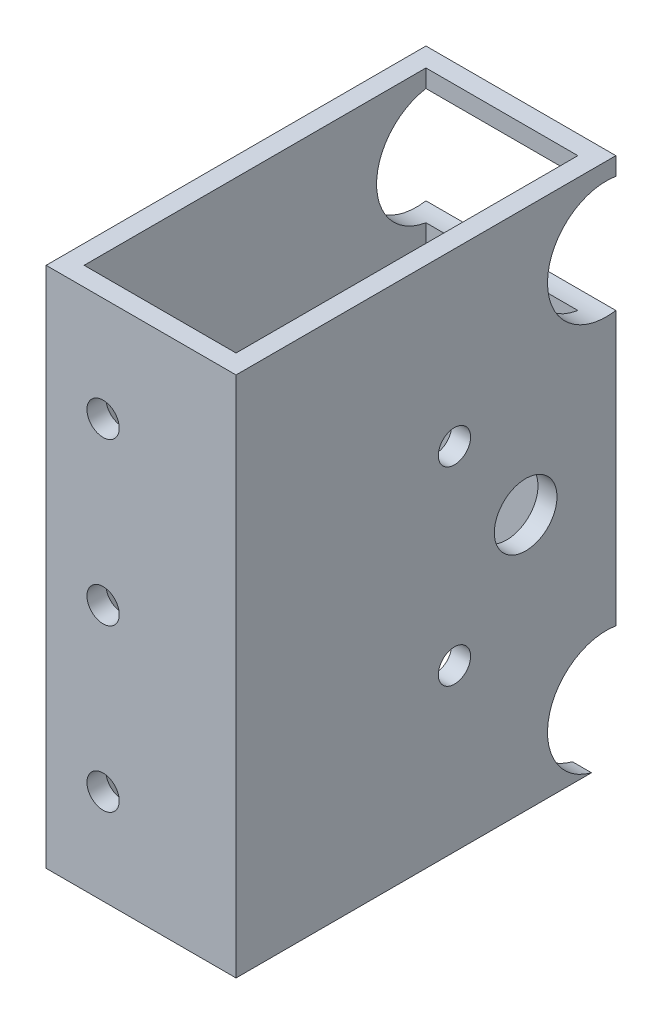
ISO-10303-21;
HEADER;
FILE_DESCRIPTION(('STEP AP214'),'2;1');
FILE_NAME('part.step','',(''),(''),'','','');
FILE_SCHEMA(('AUTOMOTIVE_DESIGN { 1 0 10303 214 1 1 1 1 }'));
ENDSEC;
DATA;
#1=APPLICATION_CONTEXT('core data for automotive mechanical design processes');
#2=APPLICATION_PROTOCOL_DEFINITION('international standard','automotive_design',2000,#1);
#3=PRODUCT_CONTEXT('',#1,'mechanical');
#4=PRODUCT('Part','Part','',(#3));
#5=PRODUCT_RELATED_PRODUCT_CATEGORY('part','',(#4));
#6=PRODUCT_DEFINITION_FORMATION('','',#4);
#7=PRODUCT_DEFINITION_CONTEXT('part definition',#1,'design');
#8=PRODUCT_DEFINITION('design','',#6,#7);
#9=PRODUCT_DEFINITION_SHAPE('','',#8);
#10=(LENGTH_UNIT() NAMED_UNIT(*) SI_UNIT(.MILLI.,.METRE.));
#11=(NAMED_UNIT(*) PLANE_ANGLE_UNIT() SI_UNIT($,.RADIAN.));
#12=(NAMED_UNIT(*) SI_UNIT($,.STERADIAN.) SOLID_ANGLE_UNIT());
#13=UNCERTAINTY_MEASURE_WITH_UNIT(LENGTH_MEASURE(1.E-05),#10,'distance_accuracy_value','');
#14=(GEOMETRIC_REPRESENTATION_CONTEXT(3) GLOBAL_UNCERTAINTY_ASSIGNED_CONTEXT((#13)) GLOBAL_UNIT_ASSIGNED_CONTEXT((#10,
#11,#12)) REPRESENTATION_CONTEXT('',''));
#15=CARTESIAN_POINT('',(0.,0.,0.));
#16=DIRECTION('',(0.,0.,1.));
#17=DIRECTION('',(1.,0.,0.));
#18=AXIS2_PLACEMENT_3D('',#15,#16,#17);
#19=CARTESIAN_POINT('',(0.,0.,-29.));
#20=DIRECTION('',(0.,0.,1.));
#21=DIRECTION('',(1.,0.,0.));
#22=AXIS2_PLACEMENT_3D('',#19,#20,#21);
#23=PLANE('',#22);
#24=DIRECTION('',(-1.,0.,0.));
#25=VECTOR('',#24,1.);
#26=CARTESIAN_POINT('',(49.9,-43.8811765836887,-29.));
#27=LINE('',#26,#25);
#28=CARTESIAN_POINT('',(29.708348754,-43.8811765836887,-29.));
#29=VERTEX_POINT('',#28);
#30=CARTESIAN_POINT('',(49.708348754,-43.8811765836887,-29.));
#31=VERTEX_POINT('',#30);
#32=EDGE_CURVE('E274',#29,#31,#27,.F.);
#33=ORIENTED_EDGE('',*,*,#32,.F.);
#34=DIRECTION('',(0.,-1.,0.));
#35=VECTOR('',#34,1.);
#36=CARTESIAN_POINT('',(29.708348754,-1.,-29.));
#37=LINE('',#36,#35);
#38=CARTESIAN_POINT('',(29.708348754,-15.1188234163113,-29.));
#39=VERTEX_POINT('',#38);
#40=EDGE_CURVE('E181',#39,#29,#37,.T.);
#41=ORIENTED_EDGE('',*,*,#40,.F.);
#42=DIRECTION('',(-1.,0.,0.));
#43=VECTOR('',#42,1.);
#44=CARTESIAN_POINT('',(49.9,-15.1188234163113,-29.));
#45=LINE('',#44,#43);
#46=CARTESIAN_POINT('',(49.708348754,-15.1188234163113,-29.));
#47=VERTEX_POINT('',#46);
#48=EDGE_CURVE('E277',#47,#39,#45,.T.);
#49=ORIENTED_EDGE('',*,*,#48,.F.);
#50=DIRECTION('',(0.,1.,0.));
#51=VECTOR('',#50,1.);
#52=CARTESIAN_POINT('',(49.708348754,-56.,-29.));
#53=LINE('',#52,#51);
#54=EDGE_CURVE('E62',#31,#47,#53,.T.);
#55=ORIENTED_EDGE('',*,*,#54,.F.);
#56=EDGE_LOOP('',(#33,#41,#49,#55));
#57=FACE_BOUND('',#56,.T.);
#58=ADVANCED_FACE('F41',(#57),#23,.F.);
#59=CARTESIAN_POINT('',(0.,0.,-27.));
#60=DIRECTION('',(0.,0.,1.));
#61=DIRECTION('',(1.,0.,0.));
#62=AXIS2_PLACEMENT_3D('',#59,#60,#61);
#63=PLANE('',#62);
#64=DIRECTION('',(0.,-1.,0.));
#65=VECTOR('',#64,1.);
#66=CARTESIAN_POINT('',(31.708348754,-0.899999999999999,-27.));
#67=LINE('',#66,#65);
#68=CARTESIAN_POINT('',(31.708348754,-15.1188234163113,-27.));
#69=VERTEX_POINT('',#68);
#70=CARTESIAN_POINT('',(31.708348754,-43.8811765836887,-27.));
#71=VERTEX_POINT('',#70);
#72=EDGE_CURVE('E158',#69,#71,#67,.T.);
#73=ORIENTED_EDGE('',*,*,#72,.T.);
#74=DIRECTION('',(-1.,0.,0.));
#75=VECTOR('',#74,1.);
#76=CARTESIAN_POINT('',(49.9,-43.8811765836887,-27.));
#77=LINE('',#76,#75);
#78=CARTESIAN_POINT('',(47.708348754,-43.8811765836887,-27.));
#79=VERTEX_POINT('',#78);
#80=EDGE_CURVE('E144',#71,#79,#77,.F.);
#81=ORIENTED_EDGE('',*,*,#80,.T.);
#82=DIRECTION('',(0.,1.,0.));
#83=VECTOR('',#82,1.);
#84=CARTESIAN_POINT('',(47.708348754,-56.1,-27.));
#85=LINE('',#84,#83);
#86=CARTESIAN_POINT('',(47.708348754,-15.1188234163113,-27.));
#87=VERTEX_POINT('',#86);
#88=EDGE_CURVE('E153',#79,#87,#85,.T.);
#89=ORIENTED_EDGE('',*,*,#88,.T.);
#90=DIRECTION('',(-1.,0.,0.));
#91=VECTOR('',#90,1.);
#92=CARTESIAN_POINT('',(49.9,-15.1188234163113,-27.));
#93=LINE('',#92,#91);
#94=EDGE_CURVE('E219',#87,#69,#93,.T.);
#95=ORIENTED_EDGE('',*,*,#94,.T.);
#96=EDGE_LOOP('',(#73,#81,#89,#95));
#97=FACE_BOUND('',#96,.T.);
#98=ADVANCED_FACE('F151',(#97),#63,.T.);
#99=CARTESIAN_POINT('',(29.708348754,-56.,11.));
#100=DIRECTION('',(0.,1.,0.));
#101=DIRECTION('',(0.,0.,1.));
#102=AXIS2_PLACEMENT_3D('',#99,#100,#101);
#103=PLANE('',#102);
#104=DIRECTION('',(-1.,0.,0.));
#105=VECTOR('',#104,1.);
#106=CARTESIAN_POINT('',(49.9,-56.,-26.4379500648187));
#107=LINE('',#106,#105);
#108=CARTESIAN_POINT('',(49.708348754,-56.,-26.4379500648187));
#109=VERTEX_POINT('',#108);
#110=CARTESIAN_POINT('',(47.708348754,-56.,-26.4379500648187));
#111=VERTEX_POINT('',#110);
#112=EDGE_CURVE('E59',#109,#111,#107,.T.);
#113=ORIENTED_EDGE('',*,*,#112,.F.);
#114=DIRECTION('',(0.,0.,-1.));
#115=VECTOR('',#114,1.);
#116=CARTESIAN_POINT('',(49.708348754,-56.,11.));
#117=LINE('',#116,#115);
#118=CARTESIAN_POINT('',(49.708348754,-56.,11.));
#119=VERTEX_POINT('',#118);
#120=EDGE_CURVE('E204',#119,#109,#117,.T.);
#121=ORIENTED_EDGE('',*,*,#120,.F.);
#122=DIRECTION('',(1.,0.,0.));
#123=VECTOR('',#122,1.);
#124=CARTESIAN_POINT('',(29.708348754,-56.,11.));
#125=LINE('',#124,#123);
#126=CARTESIAN_POINT('',(29.708348754,-56.,11.));
#127=VERTEX_POINT('',#126);
#128=EDGE_CURVE('E184',#127,#119,#125,.T.);
#129=ORIENTED_EDGE('',*,*,#128,.F.);
#130=DIRECTION('',(0.,0.,-1.));
#131=VECTOR('',#130,1.);
#132=CARTESIAN_POINT('',(29.708348754,-56.,11.));
#133=LINE('',#132,#131);
#134=CARTESIAN_POINT('',(29.708348754,-56.,-26.4379500648187));
#135=VERTEX_POINT('',#134);
#136=EDGE_CURVE('E210',#127,#135,#133,.T.);
#137=ORIENTED_EDGE('',*,*,#136,.T.);
#138=CARTESIAN_POINT('',(31.708348754,-56.,-26.4379500648187));
#139=VERTEX_POINT('',#138);
#140=EDGE_CURVE('E270',#139,#135,#107,.T.);
#141=ORIENTED_EDGE('',*,*,#140,.F.);
#142=DIRECTION('',(0.,0.,-1.));
#143=VECTOR('',#142,1.);
#144=CARTESIAN_POINT('',(31.708348754,-56.,11.));
#145=LINE('',#144,#143);
#146=CARTESIAN_POINT('',(31.708348754,-56.,9.00000000000001));
#147=VERTEX_POINT('',#146);
#148=EDGE_CURVE('E178',#147,#139,#145,.T.);
#149=ORIENTED_EDGE('',*,*,#148,.F.);
#150=DIRECTION('',(1.,0.,0.));
#151=VECTOR('',#150,1.);
#152=CARTESIAN_POINT('',(29.708348754,-56.,9.00000000000001));
#153=LINE('',#152,#151);
#154=CARTESIAN_POINT('',(47.708348754,-56.,9.00000000000001));
#155=VERTEX_POINT('',#154);
#156=EDGE_CURVE('E173',#147,#155,#153,.T.);
#157=ORIENTED_EDGE('',*,*,#156,.T.);
#158=DIRECTION('',(0.,0.,1.));
#159=VECTOR('',#158,1.);
#160=CARTESIAN_POINT('',(47.708348754,-56.,11.));
#161=LINE('',#160,#159);
#162=EDGE_CURVE('E176',#111,#155,#161,.T.);
#163=ORIENTED_EDGE('',*,*,#162,.F.);
#164=EDGE_LOOP('',(#113,#121,#129,#137,#141,#149,#157,#163));
#165=FACE_BOUND('',#164,.T.);
#166=ADVANCED_FACE('F329',(#165),#103,.F.);
#167=DIRECTION('',(-1.,0.,0.));
#168=VECTOR('',#167,1.);
#169=CARTESIAN_POINT('',(49.9,-2.88117658368866,-29.));
#170=LINE('',#169,#168);
#171=CARTESIAN_POINT('',(29.708348754,-2.88117658368866,-29.));
#172=VERTEX_POINT('',#171);
#173=CARTESIAN_POINT('',(49.708348754,-2.88117658368866,-29.));
#174=VERTEX_POINT('',#173);
#175=EDGE_CURVE('E288',#172,#174,#170,.F.);
#176=ORIENTED_EDGE('',*,*,#175,.F.);
#177=CARTESIAN_POINT('',(29.708348754,-1.,-29.));
#178=VERTEX_POINT('',#177);
#179=EDGE_CURVE('E195',#178,#172,#37,.T.);
#180=ORIENTED_EDGE('',*,*,#179,.F.);
#181=DIRECTION('',(-1.,0.,0.));
#182=VECTOR('',#181,1.);
#183=CARTESIAN_POINT('',(49.708348754,-1.,-29.));
#184=LINE('',#183,#182);
#185=CARTESIAN_POINT('',(49.708348754,-1.,-29.));
#186=VERTEX_POINT('',#185);
#187=EDGE_CURVE('E187',#186,#178,#184,.T.);
#188=ORIENTED_EDGE('',*,*,#187,.F.);
#189=EDGE_CURVE('E196',#174,#186,#53,.T.);
#190=ORIENTED_EDGE('',*,*,#189,.F.);
#191=EDGE_LOOP('',(#176,#180,#188,#190));
#192=FACE_BOUND('',#191,.T.);
#193=ADVANCED_FACE('F319',(#192),#23,.F.);
#194=CARTESIAN_POINT('',(31.708348754,-1.,-27.));
#195=VERTEX_POINT('',#194);
#196=CARTESIAN_POINT('',(31.708348754,-2.88117658368866,-27.));
#197=VERTEX_POINT('',#196);
#198=EDGE_CURVE('E169',#195,#197,#67,.T.);
#199=ORIENTED_EDGE('',*,*,#198,.T.);
#200=DIRECTION('',(-1.,0.,0.));
#201=VECTOR('',#200,1.);
#202=CARTESIAN_POINT('',(49.9,-2.88117658368866,-27.));
#203=LINE('',#202,#201);
#204=CARTESIAN_POINT('',(47.708348754,-2.88117658368866,-27.));
#205=VERTEX_POINT('',#204);
#206=EDGE_CURVE('E49',#197,#205,#203,.F.);
#207=ORIENTED_EDGE('',*,*,#206,.T.);
#208=CARTESIAN_POINT('',(47.708348754,-1.,-27.));
#209=VERTEX_POINT('',#208);
#210=EDGE_CURVE('E165',#205,#209,#85,.T.);
#211=ORIENTED_EDGE('',*,*,#210,.T.);
#212=DIRECTION('',(-1.,0.,0.));
#213=VECTOR('',#212,1.);
#214=CARTESIAN_POINT('',(49.708348754,-1.,-27.));
#215=LINE('',#214,#213);
#216=EDGE_CURVE('E208',#209,#195,#215,.T.);
#217=ORIENTED_EDGE('',*,*,#216,.T.);
#218=EDGE_LOOP('',(#199,#207,#211,#217));
#219=FACE_BOUND('',#218,.T.);
#220=ADVANCED_FACE('F299',(#219),#63,.T.);
#221=CARTESIAN_POINT('',(29.708348754,-1.,11.));
#222=DIRECTION('',(1.,0.,0.));
#223=DIRECTION('',(0.,0.,-1.));
#224=AXIS2_PLACEMENT_3D('',#221,#222,#223);
#225=PLANE('',#224);
#226=CARTESIAN_POINT('',(29.708348754,-29.,-19.5));
#227=DIRECTION('',(1.,0.,0.));
#228=DIRECTION('',(0.,0.,-1.));
#229=AXIS2_PLACEMENT_3D('',#226,#227,#228);
#230=CIRCLE('',#229,3.3);
#231=CARTESIAN_POINT('',(29.708348754,-29.,-22.8));
#232=VERTEX_POINT('',#231);
#233=EDGE_CURVE('E262',#232,#232,#230,.F.);
#234=ORIENTED_EDGE('',*,*,#233,.F.);
#235=EDGE_LOOP('',(#234));
#236=FACE_BOUND('',#235,.T.);
#237=CARTESIAN_POINT('',(29.708348754,-50.,-28.));
#238=DIRECTION('',(1.,0.,0.));
#239=DIRECTION('',(0.,0.,-1.));
#240=AXIS2_PLACEMENT_3D('',#237,#238,#239);
#241=CIRCLE('',#240,6.2);
#242=EDGE_CURVE('E275',#135,#29,#241,.F.);
#243=ORIENTED_EDGE('',*,*,#242,.F.);
#244=ORIENTED_EDGE('',*,*,#136,.F.);
#245=DIRECTION('',(0.,-1.,0.));
#246=VECTOR('',#245,1.);
#247=CARTESIAN_POINT('',(29.708348754,-1.,11.));
#248=LINE('',#247,#246);
#249=CARTESIAN_POINT('',(29.708348754,-1.,11.));
#250=VERTEX_POINT('',#249);
#251=EDGE_CURVE('E185',#250,#127,#248,.T.);
#252=ORIENTED_EDGE('',*,*,#251,.F.);
#253=DIRECTION('',(0.,0.,-1.));
#254=VECTOR('',#253,1.);
#255=CARTESIAN_POINT('',(29.708348754,-1.,11.));
#256=LINE('',#255,#254);
#257=EDGE_CURVE('E191',#250,#178,#256,.T.);
#258=ORIENTED_EDGE('',*,*,#257,.T.);
#259=ORIENTED_EDGE('',*,*,#179,.T.);
#260=CARTESIAN_POINT('',(29.708348754,-9.,-28.));
#261=DIRECTION('',(1.,0.,0.));
#262=DIRECTION('',(0.,0.,-1.));
#263=AXIS2_PLACEMENT_3D('',#260,#261,#262);
#264=CIRCLE('',#263,6.2);
#265=EDGE_CURVE('E282',#39,#172,#264,.F.);
#266=ORIENTED_EDGE('',*,*,#265,.F.);
#267=ORIENTED_EDGE('',*,*,#40,.T.);
#268=EDGE_LOOP('',(#243,#244,#252,#258,#259,#266,#267));
#269=FACE_BOUND('',#268,.T.);
#270=ADVANCED_FACE('F43',(#236,#269),#225,.F.);
#271=CARTESIAN_POINT('',(49.708348754,-56.,11.));
#272=DIRECTION('',(-1.,0.,0.));
#273=DIRECTION('',(0.,0.,1.));
#274=AXIS2_PLACEMENT_3D('',#271,#272,#273);
#275=PLANE('',#274);
#276=CARTESIAN_POINT('',(49.708348754,-39.,-12.));
#277=DIRECTION('',(-1.,0.,0.));
#278=DIRECTION('',(0.,0.,1.));
#279=AXIS2_PLACEMENT_3D('',#276,#277,#278);
#280=CIRCLE('',#279,1.7);
#281=CARTESIAN_POINT('',(49.708348754,-39.,-10.3));
#282=VERTEX_POINT('',#281);
#283=EDGE_CURVE('E245',#282,#282,#280,.F.);
#284=ORIENTED_EDGE('',*,*,#283,.F.);
#285=EDGE_LOOP('',(#284));
#286=FACE_BOUND('',#285,.T.);
#287=CARTESIAN_POINT('',(49.708348754,-19.,-12.));
#288=DIRECTION('',(-1.,0.,0.));
#289=DIRECTION('',(0.,0.,1.));
#290=AXIS2_PLACEMENT_3D('',#287,#288,#289);
#291=CIRCLE('',#290,1.7);
#292=CARTESIAN_POINT('',(49.708348754,-19.,-10.3));
#293=VERTEX_POINT('',#292);
#294=EDGE_CURVE('E237',#293,#293,#291,.F.);
#295=ORIENTED_EDGE('',*,*,#294,.F.);
#296=EDGE_LOOP('',(#295));
#297=FACE_BOUND('',#296,.T.);
#298=CARTESIAN_POINT('',(49.708348754,-29.,-19.5));
#299=DIRECTION('',(-1.,0.,0.));
#300=DIRECTION('',(0.,0.,1.));
#301=AXIS2_PLACEMENT_3D('',#298,#299,#300);
#302=CIRCLE('',#301,3.3);
#303=CARTESIAN_POINT('',(49.708348754,-29.,-16.2));
#304=VERTEX_POINT('',#303);
#305=EDGE_CURVE('E261',#304,#304,#302,.F.);
#306=ORIENTED_EDGE('',*,*,#305,.F.);
#307=EDGE_LOOP('',(#306));
#308=FACE_BOUND('',#307,.T.);
#309=CARTESIAN_POINT('',(49.708348754,-50.,-28.));
#310=DIRECTION('',(-1.,0.,0.));
#311=DIRECTION('',(0.,0.,1.));
#312=AXIS2_PLACEMENT_3D('',#309,#310,#311);
#313=CIRCLE('',#312,6.2);
#314=EDGE_CURVE('E267',#31,#109,#313,.F.);
#315=ORIENTED_EDGE('',*,*,#314,.F.);
#316=ORIENTED_EDGE('',*,*,#54,.T.);
#317=CARTESIAN_POINT('',(49.708348754,-9.,-28.));
#318=DIRECTION('',(-1.,0.,0.));
#319=DIRECTION('',(0.,0.,1.));
#320=AXIS2_PLACEMENT_3D('',#317,#318,#319);
#321=CIRCLE('',#320,6.2);
#322=EDGE_CURVE('E285',#174,#47,#321,.F.);
#323=ORIENTED_EDGE('',*,*,#322,.F.);
#324=ORIENTED_EDGE('',*,*,#189,.T.);
#325=DIRECTION('',(0.,0.,-1.));
#326=VECTOR('',#325,1.);
#327=CARTESIAN_POINT('',(49.708348754,-1.,11.));
#328=LINE('',#327,#326);
#329=CARTESIAN_POINT('',(49.708348754,-1.,11.));
#330=VERTEX_POINT('',#329);
#331=EDGE_CURVE('E203',#330,#186,#328,.T.);
#332=ORIENTED_EDGE('',*,*,#331,.F.);
#333=DIRECTION('',(0.,1.,0.));
#334=VECTOR('',#333,1.);
#335=CARTESIAN_POINT('',(49.708348754,-56.,11.));
#336=LINE('',#335,#334);
#337=EDGE_CURVE('E189',#119,#330,#336,.T.);
#338=ORIENTED_EDGE('',*,*,#337,.F.);
#339=ORIENTED_EDGE('',*,*,#120,.T.);
#340=EDGE_LOOP('',(#315,#316,#323,#324,#332,#338,#339));
#341=FACE_BOUND('',#340,.T.);
#342=ADVANCED_FACE('F314',(#286,#297,#308,#341),#275,.F.);
#343=CARTESIAN_POINT('',(49.708348754,-1.,11.));
#344=DIRECTION('',(0.,-1.,0.));
#345=DIRECTION('',(0.,0.,-1.));
#346=AXIS2_PLACEMENT_3D('',#343,#344,#345);
#347=PLANE('',#346);
#348=DIRECTION('',(0.,0.,-1.));
#349=VECTOR('',#348,1.);
#350=CARTESIAN_POINT('',(47.708348754,-1.,11.));
#351=LINE('',#350,#349);
#352=CARTESIAN_POINT('',(47.708348754,-1.00000000000001,9.00000000000001));
#353=VERTEX_POINT('',#352);
#354=EDGE_CURVE('E211',#353,#209,#351,.T.);
#355=ORIENTED_EDGE('',*,*,#354,.F.);
#356=DIRECTION('',(-1.,0.,0.));
#357=VECTOR('',#356,1.);
#358=CARTESIAN_POINT('',(49.708348754,-1.,9.00000000000001));
#359=LINE('',#358,#357);
#360=CARTESIAN_POINT('',(31.708348754,-1.,9.00000000000001));
#361=VERTEX_POINT('',#360);
#362=EDGE_CURVE('E220',#353,#361,#359,.T.);
#363=ORIENTED_EDGE('',*,*,#362,.T.);
#364=DIRECTION('',(0.,0.,1.));
#365=VECTOR('',#364,1.);
#366=CARTESIAN_POINT('',(31.708348754,-1.,11.));
#367=LINE('',#366,#365);
#368=EDGE_CURVE('E212',#195,#361,#367,.T.);
#369=ORIENTED_EDGE('',*,*,#368,.F.);
#370=ORIENTED_EDGE('',*,*,#216,.F.);
#371=EDGE_LOOP('',(#355,#363,#369,#370));
#372=FACE_BOUND('',#371,.T.);
#373=ORIENTED_EDGE('',*,*,#187,.T.);
#374=ORIENTED_EDGE('',*,*,#257,.F.);
#375=DIRECTION('',(-1.,0.,0.));
#376=VECTOR('',#375,1.);
#377=CARTESIAN_POINT('',(49.708348754,-1.,11.));
#378=LINE('',#377,#376);
#379=EDGE_CURVE('E188',#330,#250,#378,.T.);
#380=ORIENTED_EDGE('',*,*,#379,.F.);
#381=ORIENTED_EDGE('',*,*,#331,.T.);
#382=EDGE_LOOP('',(#373,#374,#380,#381));
#383=FACE_BOUND('',#382,.T.);
#384=ADVANCED_FACE('F291',(#372,#383),#347,.F.);
#385=CARTESIAN_POINT('',(0.,0.,11.));
#386=DIRECTION('',(0.,0.,1.));
#387=DIRECTION('',(1.,0.,0.));
#388=AXIS2_PLACEMENT_3D('',#385,#386,#387);
#389=PLANE('',#388);
#390=CARTESIAN_POINT('',(35.708348754,-46.,11.));
#391=DIRECTION('',(0.,0.,1.));
#392=DIRECTION('',(1.,0.,0.));
#393=AXIS2_PLACEMENT_3D('',#390,#391,#392);
#394=CIRCLE('',#393,1.7);
#395=CARTESIAN_POINT('',(37.408348754,-46.,11.));
#396=VERTEX_POINT('',#395);
#397=EDGE_CURVE('E236',#396,#396,#394,.F.);
#398=ORIENTED_EDGE('',*,*,#397,.T.);
#399=EDGE_LOOP('',(#398));
#400=FACE_BOUND('',#399,.T.);
#401=CARTESIAN_POINT('',(35.708348754,-29.,11.));
#402=DIRECTION('',(0.,0.,1.));
#403=DIRECTION('',(1.,0.,0.));
#404=AXIS2_PLACEMENT_3D('',#401,#402,#403);
#405=CIRCLE('',#404,1.7);
#406=CARTESIAN_POINT('',(37.408348754,-29.,11.));
#407=VERTEX_POINT('',#406);
#408=EDGE_CURVE('E235',#407,#407,#405,.F.);
#409=ORIENTED_EDGE('',*,*,#408,.T.);
#410=EDGE_LOOP('',(#409));
#411=FACE_BOUND('',#410,.T.);
#412=CARTESIAN_POINT('',(35.708348754,-12.,11.));
#413=DIRECTION('',(0.,0.,1.));
#414=DIRECTION('',(1.,0.,0.));
#415=AXIS2_PLACEMENT_3D('',#412,#413,#414);
#416=CIRCLE('',#415,1.7);
#417=CARTESIAN_POINT('',(37.408348754,-12.,11.));
#418=VERTEX_POINT('',#417);
#419=EDGE_CURVE('E226',#418,#418,#416,.F.);
#420=ORIENTED_EDGE('',*,*,#419,.T.);
#421=EDGE_LOOP('',(#420));
#422=FACE_BOUND('',#421,.T.);
#423=ORIENTED_EDGE('',*,*,#251,.T.);
#424=ORIENTED_EDGE('',*,*,#128,.T.);
#425=ORIENTED_EDGE('',*,*,#337,.T.);
#426=ORIENTED_EDGE('',*,*,#379,.T.);
#427=EDGE_LOOP('',(#423,#424,#425,#426));
#428=FACE_BOUND('',#427,.T.);
#429=ADVANCED_FACE('F326',(#400,#411,#422,#428),#389,.T.);
#430=CARTESIAN_POINT('',(31.708348754,-0.899999999999999,9.00000000000001));
#431=DIRECTION('',(1.,0.,0.));
#432=DIRECTION('',(0.,0.,-1.));
#433=AXIS2_PLACEMENT_3D('',#430,#431,#432);
#434=PLANE('',#433);
#435=CARTESIAN_POINT('',(31.708348754,-29.,-19.5));
#436=DIRECTION('',(1.,0.,0.));
#437=DIRECTION('',(0.,0.,-1.));
#438=AXIS2_PLACEMENT_3D('',#435,#436,#437);
#439=CIRCLE('',#438,3.3);
#440=CARTESIAN_POINT('',(31.708348754,-29.,-22.8));
#441=VERTEX_POINT('',#440);
#442=EDGE_CURVE('E227',#441,#441,#439,.F.);
#443=ORIENTED_EDGE('',*,*,#442,.T.);
#444=EDGE_LOOP('',(#443));
#445=FACE_BOUND('',#444,.T.);
#446=ORIENTED_EDGE('',*,*,#148,.T.);
#447=CARTESIAN_POINT('',(31.708348754,-50.,-28.));
#448=DIRECTION('',(1.,0.,0.));
#449=DIRECTION('',(0.,0.,-1.));
#450=AXIS2_PLACEMENT_3D('',#447,#448,#449);
#451=CIRCLE('',#450,6.2);
#452=EDGE_CURVE('E160',#139,#71,#451,.F.);
#453=ORIENTED_EDGE('',*,*,#452,.T.);
#454=ORIENTED_EDGE('',*,*,#72,.F.);
#455=CARTESIAN_POINT('',(31.708348754,-9.,-28.));
#456=DIRECTION('',(1.,0.,0.));
#457=DIRECTION('',(0.,0.,-1.));
#458=AXIS2_PLACEMENT_3D('',#455,#456,#457);
#459=CIRCLE('',#458,6.2);
#460=EDGE_CURVE('E276',#69,#197,#459,.F.);
#461=ORIENTED_EDGE('',*,*,#460,.T.);
#462=ORIENTED_EDGE('',*,*,#198,.F.);
#463=ORIENTED_EDGE('',*,*,#368,.T.);
#464=DIRECTION('',(0.,-1.,0.));
#465=VECTOR('',#464,1.);
#466=CARTESIAN_POINT('',(31.708348754,-0.899999999999999,9.00000000000001));
#467=LINE('',#466,#465);
#468=EDGE_CURVE('E161',#361,#147,#467,.T.);
#469=ORIENTED_EDGE('',*,*,#468,.T.);
#470=EDGE_LOOP('',(#446,#453,#454,#461,#462,#463,#469));
#471=FACE_BOUND('',#470,.T.);
#472=ADVANCED_FACE('F301',(#445,#471),#434,.T.);
#473=CARTESIAN_POINT('',(47.708348754,-56.1,9.00000000000001));
#474=DIRECTION('',(-1.,0.,0.));
#475=DIRECTION('',(0.,0.,1.));
#476=AXIS2_PLACEMENT_3D('',#473,#474,#475);
#477=PLANE('',#476);
#478=CARTESIAN_POINT('',(47.708348754,-39.,-12.));
#479=DIRECTION('',(-1.,0.,0.));
#480=DIRECTION('',(0.,0.,1.));
#481=AXIS2_PLACEMENT_3D('',#478,#479,#480);
#482=CIRCLE('',#481,1.7);
#483=CARTESIAN_POINT('',(47.708348754,-39.,-10.3));
#484=VERTEX_POINT('',#483);
#485=EDGE_CURVE('E44',#484,#484,#482,.F.);
#486=ORIENTED_EDGE('',*,*,#485,.T.);
#487=EDGE_LOOP('',(#486));
#488=FACE_BOUND('',#487,.T.);
#489=CARTESIAN_POINT('',(47.708348754,-19.,-12.));
#490=DIRECTION('',(-1.,0.,0.));
#491=DIRECTION('',(0.,0.,1.));
#492=AXIS2_PLACEMENT_3D('',#489,#490,#491);
#493=CIRCLE('',#492,1.7);
#494=CARTESIAN_POINT('',(47.708348754,-19.,-10.3));
#495=VERTEX_POINT('',#494);
#496=EDGE_CURVE('E239',#495,#495,#493,.F.);
#497=ORIENTED_EDGE('',*,*,#496,.T.);
#498=EDGE_LOOP('',(#497));
#499=FACE_BOUND('',#498,.T.);
#500=CARTESIAN_POINT('',(47.708348754,-29.,-19.5));
#501=DIRECTION('',(-1.,0.,0.));
#502=DIRECTION('',(0.,0.,1.));
#503=AXIS2_PLACEMENT_3D('',#500,#501,#502);
#504=CIRCLE('',#503,3.3);
#505=CARTESIAN_POINT('',(47.708348754,-29.,-16.2));
#506=VERTEX_POINT('',#505);
#507=EDGE_CURVE('E224',#506,#506,#504,.F.);
#508=ORIENTED_EDGE('',*,*,#507,.T.);
#509=EDGE_LOOP('',(#508));
#510=FACE_BOUND('',#509,.T.);
#511=ORIENTED_EDGE('',*,*,#88,.F.);
#512=CARTESIAN_POINT('',(47.708348754,-50.,-28.));
#513=DIRECTION('',(-1.,0.,0.));
#514=DIRECTION('',(0.,0.,1.));
#515=AXIS2_PLACEMENT_3D('',#512,#513,#514);
#516=CIRCLE('',#515,6.2);
#517=EDGE_CURVE('E11',#79,#111,#516,.F.);
#518=ORIENTED_EDGE('',*,*,#517,.T.);
#519=ORIENTED_EDGE('',*,*,#162,.T.);
#520=DIRECTION('',(0.,1.,0.));
#521=VECTOR('',#520,1.);
#522=CARTESIAN_POINT('',(47.708348754,-56.1,9.00000000000001));
#523=LINE('',#522,#521);
#524=EDGE_CURVE('E170',#155,#353,#523,.T.);
#525=ORIENTED_EDGE('',*,*,#524,.T.);
#526=ORIENTED_EDGE('',*,*,#354,.T.);
#527=ORIENTED_EDGE('',*,*,#210,.F.);
#528=CARTESIAN_POINT('',(47.708348754,-9.,-28.));
#529=DIRECTION('',(-1.,0.,0.));
#530=DIRECTION('',(0.,0.,1.));
#531=AXIS2_PLACEMENT_3D('',#528,#529,#530);
#532=CIRCLE('',#531,6.2);
#533=EDGE_CURVE('E162',#205,#87,#532,.F.);
#534=ORIENTED_EDGE('',*,*,#533,.T.);
#535=EDGE_LOOP('',(#511,#518,#519,#525,#526,#527,#534));
#536=FACE_BOUND('',#535,.T.);
#537=ADVANCED_FACE('F157',(#488,#499,#510,#536),#477,.T.);
#538=CARTESIAN_POINT('',(0.,0.,9.00000000000001));
#539=DIRECTION('',(0.,0.,1.));
#540=DIRECTION('',(1.,0.,0.));
#541=AXIS2_PLACEMENT_3D('',#538,#539,#540);
#542=PLANE('',#541);
#543=CARTESIAN_POINT('',(35.708348754,-46.,9.00000000000001));
#544=DIRECTION('',(0.,0.,1.));
#545=DIRECTION('',(1.,0.,0.));
#546=AXIS2_PLACEMENT_3D('',#543,#544,#545);
#547=CIRCLE('',#546,1.7);
#548=CARTESIAN_POINT('',(37.408348754,-46.,9.00000000000001));
#549=VERTEX_POINT('',#548);
#550=EDGE_CURVE('E240',#549,#549,#547,.F.);
#551=ORIENTED_EDGE('',*,*,#550,.F.);
#552=EDGE_LOOP('',(#551));
#553=FACE_BOUND('',#552,.T.);
#554=CARTESIAN_POINT('',(35.708348754,-29.,9.00000000000001));
#555=DIRECTION('',(0.,0.,1.));
#556=DIRECTION('',(1.,0.,0.));
#557=AXIS2_PLACEMENT_3D('',#554,#555,#556);
#558=CIRCLE('',#557,1.7);
#559=CARTESIAN_POINT('',(37.408348754,-29.,9.00000000000001));
#560=VERTEX_POINT('',#559);
#561=EDGE_CURVE('E231',#560,#560,#558,.F.);
#562=ORIENTED_EDGE('',*,*,#561,.F.);
#563=EDGE_LOOP('',(#562));
#564=FACE_BOUND('',#563,.T.);
#565=CARTESIAN_POINT('',(35.708348754,-12.,9.00000000000001));
#566=DIRECTION('',(0.,0.,1.));
#567=DIRECTION('',(1.,0.,0.));
#568=AXIS2_PLACEMENT_3D('',#565,#566,#567);
#569=CIRCLE('',#568,1.7);
#570=CARTESIAN_POINT('',(37.408348754,-12.,9.00000000000001));
#571=VERTEX_POINT('',#570);
#572=EDGE_CURVE('E230',#571,#571,#569,.F.);
#573=ORIENTED_EDGE('',*,*,#572,.F.);
#574=EDGE_LOOP('',(#573));
#575=FACE_BOUND('',#574,.T.);
#576=ORIENTED_EDGE('',*,*,#468,.F.);
#577=ORIENTED_EDGE('',*,*,#362,.F.);
#578=ORIENTED_EDGE('',*,*,#524,.F.);
#579=ORIENTED_EDGE('',*,*,#156,.F.);
#580=EDGE_LOOP('',(#576,#577,#578,#579));
#581=FACE_BOUND('',#580,.T.);
#582=ADVANCED_FACE('F310',(#553,#564,#575,#581),#542,.F.);
#583=CARTESIAN_POINT('',(49.9,-9.,-28.));
#584=DIRECTION('',(-1.,0.,0.));
#585=DIRECTION('',(0.,0.,1.));
#586=AXIS2_PLACEMENT_3D('',#583,#584,#585);
#587=CYLINDRICAL_SURFACE('',#586,6.2);
#588=ORIENTED_EDGE('',*,*,#460,.F.);
#589=ORIENTED_EDGE('',*,*,#94,.F.);
#590=ORIENTED_EDGE('',*,*,#533,.F.);
#591=ORIENTED_EDGE('',*,*,#206,.F.);
#592=EDGE_LOOP('',(#588,#589,#590,#591));
#593=FACE_BOUND('',#592,.T.);
#594=ORIENTED_EDGE('',*,*,#175,.T.);
#595=ORIENTED_EDGE('',*,*,#322,.T.);
#596=ORIENTED_EDGE('',*,*,#48,.T.);
#597=ORIENTED_EDGE('',*,*,#265,.T.);
#598=EDGE_LOOP('',(#594,#595,#596,#597));
#599=FACE_BOUND('',#598,.T.);
#600=ADVANCED_FACE('F302',(#593,#599),#587,.F.);
#601=CARTESIAN_POINT('',(49.9,-50.,-28.));
#602=DIRECTION('',(-1.,0.,0.));
#603=DIRECTION('',(0.,0.,1.));
#604=AXIS2_PLACEMENT_3D('',#601,#602,#603);
#605=CYLINDRICAL_SURFACE('',#604,6.2);
#606=ORIENTED_EDGE('',*,*,#32,.T.);
#607=ORIENTED_EDGE('',*,*,#314,.T.);
#608=ORIENTED_EDGE('',*,*,#112,.T.);
#609=ORIENTED_EDGE('',*,*,#517,.F.);
#610=ORIENTED_EDGE('',*,*,#80,.F.);
#611=ORIENTED_EDGE('',*,*,#452,.F.);
#612=ORIENTED_EDGE('',*,*,#140,.T.);
#613=ORIENTED_EDGE('',*,*,#242,.T.);
#614=EDGE_LOOP('',(#606,#607,#608,#609,#610,#611,#612,#613));
#615=FACE_BOUND('',#614,.T.);
#616=ADVANCED_FACE('F141',(#615),#605,.F.);
#617=CARTESIAN_POINT('',(49.9,-29.,-19.5));
#618=DIRECTION('',(-1.,0.,0.));
#619=DIRECTION('',(0.,0.,1.));
#620=AXIS2_PLACEMENT_3D('',#617,#618,#619);
#621=CYLINDRICAL_SURFACE('',#620,3.3);
#622=ORIENTED_EDGE('',*,*,#507,.F.);
#623=EDGE_LOOP('',(#622));
#624=FACE_BOUND('',#623,.T.);
#625=ORIENTED_EDGE('',*,*,#305,.T.);
#626=EDGE_LOOP('',(#625));
#627=FACE_BOUND('',#626,.T.);
#628=ADVANCED_FACE('F376',(#624,#627),#621,.F.);
#629=ORIENTED_EDGE('',*,*,#442,.F.);
#630=EDGE_LOOP('',(#629));
#631=FACE_BOUND('',#630,.T.);
#632=ORIENTED_EDGE('',*,*,#233,.T.);
#633=EDGE_LOOP('',(#632));
#634=FACE_BOUND('',#633,.T.);
#635=ADVANCED_FACE('F380',(#631,#634),#621,.F.);
#636=CARTESIAN_POINT('',(35.708348754,-12.,11.1));
#637=DIRECTION('',(0.,0.,-1.));
#638=DIRECTION('',(-1.,0.,0.));
#639=AXIS2_PLACEMENT_3D('',#636,#637,#638);
#640=CYLINDRICAL_SURFACE('',#639,1.7);
#641=ORIENTED_EDGE('',*,*,#419,.F.);
#642=EDGE_LOOP('',(#641));
#643=FACE_BOUND('',#642,.T.);
#644=ORIENTED_EDGE('',*,*,#572,.T.);
#645=EDGE_LOOP('',(#644));
#646=FACE_BOUND('',#645,.T.);
#647=ADVANCED_FACE('F379',(#643,#646),#640,.F.);
#648=CARTESIAN_POINT('',(35.708348754,-29.,11.1));
#649=DIRECTION('',(0.,0.,-1.));
#650=DIRECTION('',(-1.,0.,0.));
#651=AXIS2_PLACEMENT_3D('',#648,#649,#650);
#652=CYLINDRICAL_SURFACE('',#651,1.7);
#653=ORIENTED_EDGE('',*,*,#408,.F.);
#654=EDGE_LOOP('',(#653));
#655=FACE_BOUND('',#654,.T.);
#656=ORIENTED_EDGE('',*,*,#561,.T.);
#657=EDGE_LOOP('',(#656));
#658=FACE_BOUND('',#657,.T.);
#659=ADVANCED_FACE('F381',(#655,#658),#652,.F.);
#660=CARTESIAN_POINT('',(35.708348754,-46.,11.1));
#661=DIRECTION('',(0.,0.,-1.));
#662=DIRECTION('',(-1.,0.,0.));
#663=AXIS2_PLACEMENT_3D('',#660,#661,#662);
#664=CYLINDRICAL_SURFACE('',#663,1.7);
#665=ORIENTED_EDGE('',*,*,#397,.F.);
#666=EDGE_LOOP('',(#665));
#667=FACE_BOUND('',#666,.T.);
#668=ORIENTED_EDGE('',*,*,#550,.T.);
#669=EDGE_LOOP('',(#668));
#670=FACE_BOUND('',#669,.T.);
#671=ADVANCED_FACE('F386',(#667,#670),#664,.F.);
#672=CARTESIAN_POINT('',(49.9,-19.,-12.));
#673=DIRECTION('',(-1.,0.,0.));
#674=DIRECTION('',(0.,0.,1.));
#675=AXIS2_PLACEMENT_3D('',#672,#673,#674);
#676=CYLINDRICAL_SURFACE('',#675,1.7);
#677=ORIENTED_EDGE('',*,*,#496,.F.);
#678=EDGE_LOOP('',(#677));
#679=FACE_BOUND('',#678,.T.);
#680=ORIENTED_EDGE('',*,*,#294,.T.);
#681=EDGE_LOOP('',(#680));
#682=FACE_BOUND('',#681,.T.);
#683=ADVANCED_FACE('F391',(#679,#682),#676,.F.);
#684=CARTESIAN_POINT('',(49.9,-39.,-12.));
#685=DIRECTION('',(-1.,0.,0.));
#686=DIRECTION('',(0.,0.,1.));
#687=AXIS2_PLACEMENT_3D('',#684,#685,#686);
#688=CYLINDRICAL_SURFACE('',#687,1.7);
#689=ORIENTED_EDGE('',*,*,#485,.F.);
#690=EDGE_LOOP('',(#689));
#691=FACE_BOUND('',#690,.T.);
#692=ORIENTED_EDGE('',*,*,#283,.T.);
#693=EDGE_LOOP('',(#692));
#694=FACE_BOUND('',#693,.T.);
#695=ADVANCED_FACE('F394',(#691,#694),#688,.F.);
#696=CLOSED_SHELL('',(#58,#98,#166,#193,#220,#270,#342,#384,#429,#472,#537,#582,#600,#616,#628,
#635,#647,#659,#671,#683,#695));
#697=MANIFOLD_SOLID_BREP('B2',#696);
#698=ADVANCED_BREP_SHAPE_REPRESENTATION('',(#18,#697),#14);
#699=SHAPE_DEFINITION_REPRESENTATION(#9,#698);
ENDSEC;
END-ISO-10303-21;
